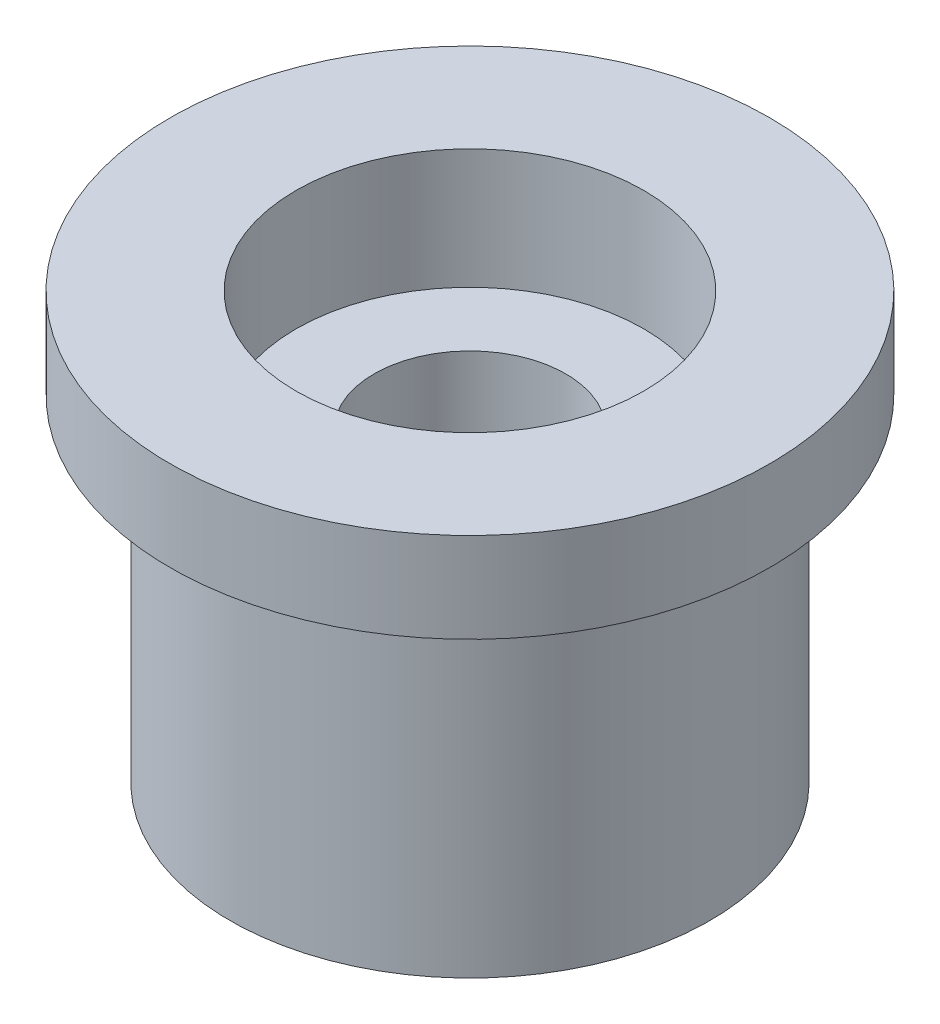
ISO-10303-21;
HEADER;
FILE_DESCRIPTION(('STEP AP214'),'2;1');
FILE_NAME('part.step','',(''),(''),'','','');
FILE_SCHEMA(('AUTOMOTIVE_DESIGN { 1 0 10303 214 1 1 1 1 }'));
ENDSEC;
DATA;
#1=APPLICATION_CONTEXT('core data for automotive mechanical design processes');
#2=APPLICATION_PROTOCOL_DEFINITION('international standard','automotive_design',2000,#1);
#3=PRODUCT_CONTEXT('',#1,'mechanical');
#4=PRODUCT('Part','Part','',(#3));
#5=PRODUCT_RELATED_PRODUCT_CATEGORY('part','',(#4));
#6=PRODUCT_DEFINITION_FORMATION('','',#4);
#7=PRODUCT_DEFINITION_CONTEXT('part definition',#1,'design');
#8=PRODUCT_DEFINITION('design','',#6,#7);
#9=PRODUCT_DEFINITION_SHAPE('','',#8);
#10=(LENGTH_UNIT() NAMED_UNIT(*) SI_UNIT(.MILLI.,.METRE.));
#11=(NAMED_UNIT(*) PLANE_ANGLE_UNIT() SI_UNIT($,.RADIAN.));
#12=(NAMED_UNIT(*) SI_UNIT($,.STERADIAN.) SOLID_ANGLE_UNIT());
#13=UNCERTAINTY_MEASURE_WITH_UNIT(LENGTH_MEASURE(1.E-05),#10,'distance_accuracy_value','');
#14=(GEOMETRIC_REPRESENTATION_CONTEXT(3) GLOBAL_UNCERTAINTY_ASSIGNED_CONTEXT((#13)) GLOBAL_UNIT_ASSIGNED_CONTEXT((#10,
#11,#12)) REPRESENTATION_CONTEXT('',''));
#15=CARTESIAN_POINT('',(0.,0.,0.));
#16=DIRECTION('',(0.,0.,1.));
#17=DIRECTION('',(1.,0.,0.));
#18=AXIS2_PLACEMENT_3D('',#15,#16,#17);
#19=CARTESIAN_POINT('',(0.,7.1,0.));
#20=DIRECTION('',(0.,-1.,0.));
#21=DIRECTION('',(0.,0.,-1.));
#22=AXIS2_PLACEMENT_3D('',#19,#20,#21);
#23=CYLINDRICAL_SURFACE('',#22,5.);
#24=CARTESIAN_POINT('',(0.,7.1,0.));
#25=DIRECTION('',(0.,-1.,0.));
#26=DIRECTION('',(0.,0.,-1.));
#27=AXIS2_PLACEMENT_3D('',#24,#25,#26);
#28=CIRCLE('',#27,5.);
#29=CARTESIAN_POINT('',(0.,7.1,-5.));
#30=VERTEX_POINT('',#29);
#31=EDGE_CURVE('E40',#30,#30,#28,.T.);
#32=ORIENTED_EDGE('',*,*,#31,.T.);
#33=EDGE_LOOP('',(#32));
#34=FACE_BOUND('',#33,.T.);
#35=CARTESIAN_POINT('',(0.,5.6,0.));
#36=DIRECTION('',(0.,-1.,0.));
#37=DIRECTION('',(0.,0.,-1.));
#38=AXIS2_PLACEMENT_3D('',#35,#36,#37);
#39=CIRCLE('',#38,5.);
#40=CARTESIAN_POINT('',(0.,5.6,-5.));
#41=VERTEX_POINT('',#40);
#42=EDGE_CURVE('E231',#41,#41,#39,.T.);
#43=ORIENTED_EDGE('',*,*,#42,.F.);
#44=EDGE_LOOP('',(#43));
#45=FACE_BOUND('',#44,.T.);
#46=ADVANCED_FACE('F37',(#34,#45),#23,.T.);
#47=CARTESIAN_POINT('',(5.,7.1,0.));
#48=DIRECTION('',(0.,1.,0.));
#49=DIRECTION('',(0.,0.,1.));
#50=AXIS2_PLACEMENT_3D('',#47,#48,#49);
#51=PLANE('',#50);
#52=CARTESIAN_POINT('',(0.,7.1,0.));
#53=DIRECTION('',(0.,1.,0.));
#54=DIRECTION('',(0.,0.,1.));
#55=AXIS2_PLACEMENT_3D('',#52,#53,#54);
#56=CIRCLE('',#55,2.9);
#57=CARTESIAN_POINT('',(0.,7.1,2.9));
#58=VERTEX_POINT('',#57);
#59=EDGE_CURVE('E331',#58,#58,#56,.T.);
#60=ORIENTED_EDGE('',*,*,#59,.F.);
#61=EDGE_LOOP('',(#60));
#62=FACE_BOUND('',#61,.T.);
#63=ORIENTED_EDGE('',*,*,#31,.F.);
#64=EDGE_LOOP('',(#63));
#65=FACE_BOUND('',#64,.T.);
#66=ADVANCED_FACE('F240',(#62,#65),#51,.T.);
#67=CARTESIAN_POINT('',(0.,5.6,0.));
#68=DIRECTION('',(0.,-1.,0.));
#69=DIRECTION('',(0.,0.,-1.));
#70=AXIS2_PLACEMENT_3D('',#67,#68,#69);
#71=PLANE('',#70);
#72=CARTESIAN_POINT('',(0.,5.6,0.));
#73=DIRECTION('',(0.,-1.,0.));
#74=DIRECTION('',(0.,0.,-1.));
#75=AXIS2_PLACEMENT_3D('',#72,#73,#74);
#76=CIRCLE('',#75,4.);
#77=CARTESIAN_POINT('',(0.,5.6,-4.));
#78=VERTEX_POINT('',#77);
#79=EDGE_CURVE('E11',#78,#78,#76,.T.);
#80=ORIENTED_EDGE('',*,*,#79,.F.);
#81=EDGE_LOOP('',(#80));
#82=FACE_BOUND('',#81,.T.);
#83=ORIENTED_EDGE('',*,*,#42,.T.);
#84=EDGE_LOOP('',(#83));
#85=FACE_BOUND('',#84,.T.);
#86=ADVANCED_FACE('F242',(#82,#85),#71,.T.);
#87=CARTESIAN_POINT('',(0.,0.,0.));
#88=DIRECTION('',(0.,1.,0.));
#89=DIRECTION('',(0.,0.,1.));
#90=AXIS2_PLACEMENT_3D('',#87,#88,#89);
#91=CYLINDRICAL_SURFACE('',#90,4.);
#92=CARTESIAN_POINT('',(0.,0.,0.));
#93=DIRECTION('',(0.,-1.,0.));
#94=DIRECTION('',(0.,0.,-1.));
#95=AXIS2_PLACEMENT_3D('',#92,#93,#94);
#96=CIRCLE('',#95,4.);
#97=CARTESIAN_POINT('',(0.,0.,-4.));
#98=VERTEX_POINT('',#97);
#99=EDGE_CURVE('E223',#98,#98,#96,.T.);
#100=ORIENTED_EDGE('',*,*,#99,.F.);
#101=EDGE_LOOP('',(#100));
#102=FACE_BOUND('',#101,.T.);
#103=ORIENTED_EDGE('',*,*,#79,.T.);
#104=EDGE_LOOP('',(#103));
#105=FACE_BOUND('',#104,.T.);
#106=ADVANCED_FACE('F248',(#102,#105),#91,.T.);
#107=CARTESIAN_POINT('',(0.,0.,0.));
#108=DIRECTION('',(0.,-1.,0.));
#109=DIRECTION('',(0.,0.,-1.));
#110=AXIS2_PLACEMENT_3D('',#107,#108,#109);
#111=PLANE('',#110);
#112=CARTESIAN_POINT('',(0.,0.,0.));
#113=DIRECTION('',(0.,1.,0.));
#114=DIRECTION('',(0.,0.,1.));
#115=AXIS2_PLACEMENT_3D('',#112,#113,#114);
#116=CIRCLE('',#115,1.60000000000001);
#117=CARTESIAN_POINT('',(0.,0.,1.60000000000001));
#118=VERTEX_POINT('',#117);
#119=EDGE_CURVE('E152',#118,#118,#116,.T.);
#120=ORIENTED_EDGE('',*,*,#119,.T.);
#121=EDGE_LOOP('',(#120));
#122=FACE_BOUND('',#121,.T.);
#123=CARTESIAN_POINT('',(0.,0.,0.));
#124=DIRECTION('',(0.,1.,0.));
#125=DIRECTION('',(0.,0.,1.));
#126=AXIS2_PLACEMENT_3D('',#123,#124,#125);
#127=CIRCLE('',#126,2.29999999999977);
#128=CARTESIAN_POINT('',(-0.786065003776485,0.,2.16150452459318));
#129=VERTEX_POINT('',#128);
#130=CARTESIAN_POINT('',(2.264950330581,0.,0.4));
#131=VERTEX_POINT('',#130);
#132=EDGE_CURVE('E52',#129,#131,#127,.T.);
#133=ORIENTED_EDGE('',*,*,#132,.F.);
#134=DIRECTION('',(0.500000000000154,0.,-0.866025403784349));
#135=VECTOR('',#134,1.);
#136=CARTESIAN_POINT('',(-1.19063245338013,0.,2.86223590239496));
#137=LINE('',#136,#135);
#138=CARTESIAN_POINT('',(-1.19063245338013,0.,2.86223590239497));
#139=VERTEX_POINT('',#138);
#140=EDGE_CURVE('E146',#139,#129,#137,.T.);
#141=ORIENTED_EDGE('',*,*,#140,.F.);
#142=CARTESIAN_POINT('',(0.,0.,0.));
#143=DIRECTION('',(0.,-1.,0.));
#144=DIRECTION('',(0.,0.,-1.));
#145=AXIS2_PLACEMENT_3D('',#142,#143,#144);
#146=CIRCLE('',#145,3.10000000000012);
#147=CARTESIAN_POINT('',(3.074085229788,0.,0.4));
#148=VERTEX_POINT('',#147);
#149=EDGE_CURVE('E149',#148,#139,#146,.T.);
#150=ORIENTED_EDGE('',*,*,#149,.F.);
#151=DIRECTION('',(1.,0.,0.));
#152=VECTOR('',#151,1.);
#153=CARTESIAN_POINT('',(2.264950330581,0.,0.4));
#154=LINE('',#153,#152);
#155=EDGE_CURVE('E158',#131,#148,#154,.T.);
#156=ORIENTED_EDGE('',*,*,#155,.F.);
#157=EDGE_LOOP('',(#133,#141,#150,#156));
#158=FACE_BOUND('',#157,.T.);
#159=CARTESIAN_POINT('',(-1.0842021724855E-13,0.,0.));
#160=DIRECTION('',(0.,-1.,0.));
#161=DIRECTION('',(0.,0.,-1.));
#162=AXIS2_PLACEMENT_3D('',#159,#160,#161);
#163=CIRCLE('',#162,3.10000000000023);
#164=CARTESIAN_POINT('',(-1.19063245338049,0.,-2.86223590239497));
#165=VERTEX_POINT('',#164);
#166=CARTESIAN_POINT('',(3.074085229788,0.,-0.4));
#167=VERTEX_POINT('',#166);
#168=EDGE_CURVE('E60',#165,#167,#163,.T.);
#169=ORIENTED_EDGE('',*,*,#168,.F.);
#170=DIRECTION('',(-0.499999999999961,0.,-0.866025403784461));
#171=VECTOR('',#170,1.);
#172=CARTESIAN_POINT('',(-0.786065003777031,0.,-2.16150452459314));
#173=LINE('',#172,#171);
#174=CARTESIAN_POINT('',(-0.78606500377703,0.,-2.16150452459314));
#175=VERTEX_POINT('',#174);
#176=EDGE_CURVE('E171',#175,#165,#173,.T.);
#177=ORIENTED_EDGE('',*,*,#176,.F.);
#178=CARTESIAN_POINT('',(-1.0842021724855E-13,0.,0.));
#179=DIRECTION('',(0.,1.,0.));
#180=DIRECTION('',(0.,0.,1.));
#181=AXIS2_PLACEMENT_3D('',#178,#179,#180);
#182=CIRCLE('',#181,2.29999999999989);
#183=CARTESIAN_POINT('',(2.264950330581,0.,-0.4));
#184=VERTEX_POINT('',#183);
#185=EDGE_CURVE('E185',#184,#175,#182,.T.);
#186=ORIENTED_EDGE('',*,*,#185,.F.);
#187=DIRECTION('',(-1.,0.,0.));
#188=VECTOR('',#187,1.);
#189=CARTESIAN_POINT('',(3.074085229788,0.,-0.4));
#190=LINE('',#189,#188);
#191=EDGE_CURVE('E182',#167,#184,#190,.T.);
#192=ORIENTED_EDGE('',*,*,#191,.F.);
#193=EDGE_LOOP('',(#169,#177,#186,#192));
#194=FACE_BOUND('',#193,.T.);
#195=CARTESIAN_POINT('',(0.,0.,0.));
#196=DIRECTION('',(0.,1.,0.));
#197=DIRECTION('',(0.,0.,1.));
#198=AXIS2_PLACEMENT_3D('',#195,#196,#197);
#199=CIRCLE('',#198,2.29999999999955);
#200=CARTESIAN_POINT('',(-1.47888532680428,0.,-1.76150452459284));
#201=VERTEX_POINT('',#200);
#202=CARTESIAN_POINT('',(-1.478885326804,0.,1.761504524593));
#203=VERTEX_POINT('',#202);
#204=EDGE_CURVE('E192',#201,#203,#199,.T.);
#205=ORIENTED_EDGE('',*,*,#204,.F.);
#206=DIRECTION('',(0.499999980511174,0.,0.866025415036317));
#207=VECTOR('',#206,1.);
#208=CARTESIAN_POINT('',(-1.88345276182339,0.,-2.4622359135509));
#209=LINE('',#208,#207);
#210=CARTESIAN_POINT('',(-1.88345276182338,0.,-2.46223591355089));
#211=VERTEX_POINT('',#210);
#212=EDGE_CURVE('E202',#211,#201,#209,.T.);
#213=ORIENTED_EDGE('',*,*,#212,.F.);
#214=CARTESIAN_POINT('',(0.,0.,0.));
#215=DIRECTION('',(0.,-1.,0.));
#216=DIRECTION('',(0.,0.,-1.));
#217=AXIS2_PLACEMENT_3D('',#214,#215,#216);
#218=CIRCLE('',#217,3.09999999999998);
#219=CARTESIAN_POINT('',(-1.88345277640753,0.,2.46223590239492));
#220=VERTEX_POINT('',#219);
#221=EDGE_CURVE('E216',#220,#211,#218,.T.);
#222=ORIENTED_EDGE('',*,*,#221,.F.);
#223=DIRECTION('',(-0.499999999999975,0.,0.866025403784453));
#224=VECTOR('',#223,1.);
#225=CARTESIAN_POINT('',(-1.478885326804,0.,1.761504524593));
#226=LINE('',#225,#224);
#227=EDGE_CURVE('E213',#203,#220,#226,.T.);
#228=ORIENTED_EDGE('',*,*,#227,.F.);
#229=EDGE_LOOP('',(#205,#213,#222,#228));
#230=FACE_BOUND('',#229,.T.);
#231=ORIENTED_EDGE('',*,*,#99,.T.);
#232=EDGE_LOOP('',(#231));
#233=FACE_BOUND('',#232,.T.);
#234=ADVANCED_FACE('F255',(#122,#158,#194,#230,#233),#111,.T.);
#235=CARTESIAN_POINT('',(0.,4.3,0.));
#236=DIRECTION('',(0.,-1.,0.));
#237=DIRECTION('',(0.,0.,-1.));
#238=AXIS2_PLACEMENT_3D('',#235,#236,#237);
#239=CYLINDRICAL_SURFACE('',#238,2.29999999999955);
#240=ORIENTED_EDGE('',*,*,#204,.T.);
#241=DIRECTION('',(0.,-1.,0.));
#242=VECTOR('',#241,1.);
#243=CARTESIAN_POINT('',(-1.478885326804,4.3,1.761504524593));
#244=LINE('',#243,#242);
#245=CARTESIAN_POINT('',(-1.478885326804,4.3,1.761504524593));
#246=VERTEX_POINT('',#245);
#247=EDGE_CURVE('E211',#246,#203,#244,.T.);
#248=ORIENTED_EDGE('',*,*,#247,.F.);
#249=CARTESIAN_POINT('',(0.,4.3,0.));
#250=DIRECTION('',(0.,1.,0.));
#251=DIRECTION('',(0.,0.,1.));
#252=AXIS2_PLACEMENT_3D('',#249,#250,#251);
#253=CIRCLE('',#252,2.29999999999955);
#254=CARTESIAN_POINT('',(-1.47888532680428,4.3,-1.76150452459284));
#255=VERTEX_POINT('',#254);
#256=EDGE_CURVE('E198',#255,#246,#253,.T.);
#257=ORIENTED_EDGE('',*,*,#256,.F.);
#258=DIRECTION('',(0.,-1.,0.));
#259=VECTOR('',#258,1.);
#260=CARTESIAN_POINT('',(-1.47888532680428,4.3,-1.76150452459284));
#261=LINE('',#260,#259);
#262=EDGE_CURVE('E221',#255,#201,#261,.T.);
#263=ORIENTED_EDGE('',*,*,#262,.T.);
#264=EDGE_LOOP('',(#240,#248,#257,#263));
#265=FACE_BOUND('',#264,.T.);
#266=ADVANCED_FACE('F259',(#265),#239,.T.);
#267=CARTESIAN_POINT('',(-1.88345276182339,4.3,-2.4622359135509));
#268=DIRECTION('',(0.866025415036317,0.,-0.499999980511174));
#269=DIRECTION('',(-0.499999980511174,0.,-0.866025415036317));
#270=AXIS2_PLACEMENT_3D('',#267,#268,#269);
#271=PLANE('',#270);
#272=ORIENTED_EDGE('',*,*,#212,.T.);
#273=ORIENTED_EDGE('',*,*,#262,.F.);
#274=DIRECTION('',(0.499999980511174,0.,0.866025415036317));
#275=VECTOR('',#274,1.);
#276=CARTESIAN_POINT('',(-1.88345276182339,4.3,-2.4622359135509));
#277=LINE('',#276,#275);
#278=CARTESIAN_POINT('',(-1.88345276182338,4.3,-2.46223591355089));
#279=VERTEX_POINT('',#278);
#280=EDGE_CURVE('E208',#279,#255,#277,.T.);
#281=ORIENTED_EDGE('',*,*,#280,.F.);
#282=DIRECTION('',(0.,-1.,0.));
#283=VECTOR('',#282,1.);
#284=CARTESIAN_POINT('',(-1.88345276182338,4.3,-2.46223591355089));
#285=LINE('',#284,#283);
#286=EDGE_CURVE('E224',#279,#211,#285,.T.);
#287=ORIENTED_EDGE('',*,*,#286,.T.);
#288=EDGE_LOOP('',(#272,#273,#281,#287));
#289=FACE_BOUND('',#288,.T.);
#290=ADVANCED_FACE('F263',(#289),#271,.F.);
#291=CARTESIAN_POINT('',(0.,4.3,0.));
#292=DIRECTION('',(0.,-1.,0.));
#293=DIRECTION('',(0.,0.,-1.));
#294=AXIS2_PLACEMENT_3D('',#291,#292,#293);
#295=CYLINDRICAL_SURFACE('',#294,3.09999999999998);
#296=ORIENTED_EDGE('',*,*,#221,.T.);
#297=ORIENTED_EDGE('',*,*,#286,.F.);
#298=CARTESIAN_POINT('',(0.,4.3,0.));
#299=DIRECTION('',(0.,-1.,0.));
#300=DIRECTION('',(0.,0.,-1.));
#301=AXIS2_PLACEMENT_3D('',#298,#299,#300);
#302=CIRCLE('',#301,3.09999999999998);
#303=CARTESIAN_POINT('',(-1.88345277640753,4.3,2.46223590239492));
#304=VERTEX_POINT('',#303);
#305=EDGE_CURVE('E205',#304,#279,#302,.T.);
#306=ORIENTED_EDGE('',*,*,#305,.F.);
#307=DIRECTION('',(0.,-1.,0.));
#308=VECTOR('',#307,1.);
#309=CARTESIAN_POINT('',(-1.88345277640753,4.3,2.46223590239492));
#310=LINE('',#309,#308);
#311=EDGE_CURVE('E226',#304,#220,#310,.T.);
#312=ORIENTED_EDGE('',*,*,#311,.T.);
#313=EDGE_LOOP('',(#296,#297,#306,#312));
#314=FACE_BOUND('',#313,.T.);
#315=ADVANCED_FACE('F269',(#314),#295,.F.);
#316=CARTESIAN_POINT('',(-1.478885326804,4.3,1.761504524593));
#317=DIRECTION('',(0.866025403784453,0.,0.499999999999975));
#318=DIRECTION('',(0.499999999999975,0.,-0.866025403784453));
#319=AXIS2_PLACEMENT_3D('',#316,#317,#318);
#320=PLANE('',#319);
#321=ORIENTED_EDGE('',*,*,#227,.T.);
#322=ORIENTED_EDGE('',*,*,#311,.F.);
#323=DIRECTION('',(-0.499999999999975,0.,0.866025403784453));
#324=VECTOR('',#323,1.);
#325=CARTESIAN_POINT('',(-1.478885326804,4.3,1.761504524593));
#326=LINE('',#325,#324);
#327=EDGE_CURVE('E201',#246,#304,#326,.T.);
#328=ORIENTED_EDGE('',*,*,#327,.F.);
#329=ORIENTED_EDGE('',*,*,#247,.T.);
#330=EDGE_LOOP('',(#321,#322,#328,#329));
#331=FACE_BOUND('',#330,.T.);
#332=ADVANCED_FACE('F265',(#331),#320,.F.);
#333=CARTESIAN_POINT('',(0.,4.3,0.));
#334=DIRECTION('',(0.,1.,0.));
#335=DIRECTION('',(0.,0.,1.));
#336=AXIS2_PLACEMENT_3D('',#333,#334,#335);
#337=PLANE('',#336);
#338=ORIENTED_EDGE('',*,*,#256,.T.);
#339=ORIENTED_EDGE('',*,*,#327,.T.);
#340=ORIENTED_EDGE('',*,*,#305,.T.);
#341=ORIENTED_EDGE('',*,*,#280,.T.);
#342=EDGE_LOOP('',(#338,#339,#340,#341));
#343=FACE_BOUND('',#342,.T.);
#344=ADVANCED_FACE('F268',(#343),#337,.F.);
#345=CARTESIAN_POINT('',(-1.0842021724855E-13,4.3,0.));
#346=DIRECTION('',(0.,-1.,0.));
#347=DIRECTION('',(0.,0.,-1.));
#348=AXIS2_PLACEMENT_3D('',#345,#346,#347);
#349=CYLINDRICAL_SURFACE('',#348,3.10000000000023);
#350=ORIENTED_EDGE('',*,*,#168,.T.);
#351=DIRECTION('',(0.,-1.,0.));
#352=VECTOR('',#351,1.);
#353=CARTESIAN_POINT('',(3.074085229788,4.3,-0.4));
#354=LINE('',#353,#352);
#355=CARTESIAN_POINT('',(3.074085229788,4.3,-0.4));
#356=VERTEX_POINT('',#355);
#357=EDGE_CURVE('E180',#356,#167,#354,.T.);
#358=ORIENTED_EDGE('',*,*,#357,.F.);
#359=CARTESIAN_POINT('',(-1.0842021724855E-13,4.3,0.));
#360=DIRECTION('',(0.,-1.,0.));
#361=DIRECTION('',(0.,0.,-1.));
#362=AXIS2_PLACEMENT_3D('',#359,#360,#361);
#363=CIRCLE('',#362,3.10000000000023);
#364=CARTESIAN_POINT('',(-1.19063245338049,4.3,-2.86223590239497));
#365=VERTEX_POINT('',#364);
#366=EDGE_CURVE('E167',#365,#356,#363,.T.);
#367=ORIENTED_EDGE('',*,*,#366,.F.);
#368=DIRECTION('',(0.,-1.,0.));
#369=VECTOR('',#368,1.);
#370=CARTESIAN_POINT('',(-1.19063245338049,4.3,-2.86223590239497));
#371=LINE('',#370,#369);
#372=EDGE_CURVE('E190',#365,#165,#371,.T.);
#373=ORIENTED_EDGE('',*,*,#372,.T.);
#374=EDGE_LOOP('',(#350,#358,#367,#373));
#375=FACE_BOUND('',#374,.T.);
#376=ADVANCED_FACE('F279',(#375),#349,.F.);
#377=CARTESIAN_POINT('',(-0.786065003777031,4.3,-2.16150452459314));
#378=DIRECTION('',(-0.866025403784461,0.,0.499999999999961));
#379=DIRECTION('',(0.499999999999961,0.,0.866025403784461));
#380=AXIS2_PLACEMENT_3D('',#377,#378,#379);
#381=PLANE('',#380);
#382=ORIENTED_EDGE('',*,*,#176,.T.);
#383=ORIENTED_EDGE('',*,*,#372,.F.);
#384=DIRECTION('',(-0.499999999999961,0.,-0.866025403784461));
#385=VECTOR('',#384,1.);
#386=CARTESIAN_POINT('',(-0.786065003777031,4.3,-2.16150452459314));
#387=LINE('',#386,#385);
#388=CARTESIAN_POINT('',(-0.78606500377703,4.3,-2.16150452459314));
#389=VERTEX_POINT('',#388);
#390=EDGE_CURVE('E177',#389,#365,#387,.T.);
#391=ORIENTED_EDGE('',*,*,#390,.F.);
#392=DIRECTION('',(0.,-1.,0.));
#393=VECTOR('',#392,1.);
#394=CARTESIAN_POINT('',(-0.78606500377703,4.3,-2.16150452459314));
#395=LINE('',#394,#393);
#396=EDGE_CURVE('E193',#389,#175,#395,.T.);
#397=ORIENTED_EDGE('',*,*,#396,.T.);
#398=EDGE_LOOP('',(#382,#383,#391,#397));
#399=FACE_BOUND('',#398,.T.);
#400=ADVANCED_FACE('F283',(#399),#381,.F.);
#401=CARTESIAN_POINT('',(-1.0842021724855E-13,4.3,0.));
#402=DIRECTION('',(0.,-1.,0.));
#403=DIRECTION('',(0.,0.,-1.));
#404=AXIS2_PLACEMENT_3D('',#401,#402,#403);
#405=CYLINDRICAL_SURFACE('',#404,2.29999999999989);
#406=ORIENTED_EDGE('',*,*,#185,.T.);
#407=ORIENTED_EDGE('',*,*,#396,.F.);
#408=CARTESIAN_POINT('',(-1.0842021724855E-13,4.3,0.));
#409=DIRECTION('',(0.,1.,0.));
#410=DIRECTION('',(0.,0.,1.));
#411=AXIS2_PLACEMENT_3D('',#408,#409,#410);
#412=CIRCLE('',#411,2.29999999999989);
#413=CARTESIAN_POINT('',(2.264950330581,4.3,-0.4));
#414=VERTEX_POINT('',#413);
#415=EDGE_CURVE('E174',#414,#389,#412,.T.);
#416=ORIENTED_EDGE('',*,*,#415,.F.);
#417=DIRECTION('',(0.,-1.,0.));
#418=VECTOR('',#417,1.);
#419=CARTESIAN_POINT('',(2.264950330581,4.3,-0.4));
#420=LINE('',#419,#418);
#421=EDGE_CURVE('E195',#414,#184,#420,.T.);
#422=ORIENTED_EDGE('',*,*,#421,.T.);
#423=EDGE_LOOP('',(#406,#407,#416,#422));
#424=FACE_BOUND('',#423,.T.);
#425=ADVANCED_FACE('F288',(#424),#405,.T.);
#426=CARTESIAN_POINT('',(3.074085229788,4.3,-0.4));
#427=DIRECTION('',(0.,0.,1.));
#428=DIRECTION('',(1.,0.,0.));
#429=AXIS2_PLACEMENT_3D('',#426,#427,#428);
#430=PLANE('',#429);
#431=ORIENTED_EDGE('',*,*,#191,.T.);
#432=ORIENTED_EDGE('',*,*,#421,.F.);
#433=DIRECTION('',(-1.,0.,0.));
#434=VECTOR('',#433,1.);
#435=CARTESIAN_POINT('',(3.074085229788,4.3,-0.4));
#436=LINE('',#435,#434);
#437=EDGE_CURVE('E170',#356,#414,#436,.T.);
#438=ORIENTED_EDGE('',*,*,#437,.F.);
#439=ORIENTED_EDGE('',*,*,#357,.T.);
#440=EDGE_LOOP('',(#431,#432,#438,#439));
#441=FACE_BOUND('',#440,.T.);
#442=ADVANCED_FACE('F284',(#441),#430,.F.);
#443=CARTESIAN_POINT('',(-1.0842021724855E-13,4.3,0.));
#444=DIRECTION('',(0.,-1.,0.));
#445=DIRECTION('',(0.,0.,-1.));
#446=AXIS2_PLACEMENT_3D('',#443,#444,#445);
#447=PLANE('',#446);
#448=ORIENTED_EDGE('',*,*,#366,.T.);
#449=ORIENTED_EDGE('',*,*,#437,.T.);
#450=ORIENTED_EDGE('',*,*,#415,.T.);
#451=ORIENTED_EDGE('',*,*,#390,.T.);
#452=EDGE_LOOP('',(#448,#449,#450,#451));
#453=FACE_BOUND('',#452,.T.);
#454=ADVANCED_FACE('F287',(#453),#447,.T.);
#455=CARTESIAN_POINT('',(0.,4.3,0.));
#456=DIRECTION('',(0.,-1.,0.));
#457=DIRECTION('',(0.,0.,-1.));
#458=AXIS2_PLACEMENT_3D('',#455,#456,#457);
#459=CYLINDRICAL_SURFACE('',#458,2.29999999999977);
#460=ORIENTED_EDGE('',*,*,#132,.T.);
#461=DIRECTION('',(0.,-1.,0.));
#462=VECTOR('',#461,1.);
#463=CARTESIAN_POINT('',(2.264950330581,4.3,0.4));
#464=LINE('',#463,#462);
#465=CARTESIAN_POINT('',(2.264950330581,4.3,0.4));
#466=VERTEX_POINT('',#465);
#467=EDGE_CURVE('E124',#466,#131,#464,.T.);
#468=ORIENTED_EDGE('',*,*,#467,.F.);
#469=CARTESIAN_POINT('',(0.,4.3,0.));
#470=DIRECTION('',(0.,1.,0.));
#471=DIRECTION('',(0.,0.,1.));
#472=AXIS2_PLACEMENT_3D('',#469,#470,#471);
#473=CIRCLE('',#472,2.29999999999977);
#474=CARTESIAN_POINT('',(-0.786065003776485,4.3,2.16150452459318));
#475=VERTEX_POINT('',#474);
#476=EDGE_CURVE('E128',#475,#466,#473,.T.);
#477=ORIENTED_EDGE('',*,*,#476,.F.);
#478=DIRECTION('',(0.,-1.,0.));
#479=VECTOR('',#478,1.);
#480=CARTESIAN_POINT('',(-0.786065003776485,4.3,2.16150452459318));
#481=LINE('',#480,#479);
#482=EDGE_CURVE('E162',#475,#129,#481,.T.);
#483=ORIENTED_EDGE('',*,*,#482,.T.);
#484=EDGE_LOOP('',(#460,#468,#477,#483));
#485=FACE_BOUND('',#484,.T.);
#486=ADVANCED_FACE('F126',(#485),#459,.T.);
#487=CARTESIAN_POINT('',(-1.19063245338013,4.3,2.86223590239496));
#488=DIRECTION('',(-0.86602540378435,0.,-0.500000000000154));
#489=DIRECTION('',(-0.500000000000154,0.,0.86602540378435));
#490=AXIS2_PLACEMENT_3D('',#487,#488,#489);
#491=PLANE('',#490);
#492=ORIENTED_EDGE('',*,*,#140,.T.);
#493=ORIENTED_EDGE('',*,*,#482,.F.);
#494=DIRECTION('',(0.500000000000154,0.,-0.866025403784349));
#495=VECTOR('',#494,1.);
#496=CARTESIAN_POINT('',(-1.19063245338013,4.3,2.86223590239496));
#497=LINE('',#496,#495);
#498=CARTESIAN_POINT('',(-1.19063245338013,4.3,2.86223590239497));
#499=VERTEX_POINT('',#498);
#500=EDGE_CURVE('E134',#499,#475,#497,.T.);
#501=ORIENTED_EDGE('',*,*,#500,.F.);
#502=DIRECTION('',(0.,-1.,0.));
#503=VECTOR('',#502,1.);
#504=CARTESIAN_POINT('',(-1.19063245338013,4.3,2.86223590239497));
#505=LINE('',#504,#503);
#506=EDGE_CURVE('E164',#499,#139,#505,.T.);
#507=ORIENTED_EDGE('',*,*,#506,.T.);
#508=EDGE_LOOP('',(#492,#493,#501,#507));
#509=FACE_BOUND('',#508,.T.);
#510=ADVANCED_FACE('F301',(#509),#491,.F.);
#511=CARTESIAN_POINT('',(0.,4.3,0.));
#512=DIRECTION('',(0.,-1.,0.));
#513=DIRECTION('',(0.,0.,-1.));
#514=AXIS2_PLACEMENT_3D('',#511,#512,#513);
#515=CYLINDRICAL_SURFACE('',#514,3.10000000000012);
#516=ORIENTED_EDGE('',*,*,#149,.T.);
#517=ORIENTED_EDGE('',*,*,#506,.F.);
#518=CARTESIAN_POINT('',(0.,4.3,0.));
#519=DIRECTION('',(0.,-1.,0.));
#520=DIRECTION('',(0.,0.,-1.));
#521=AXIS2_PLACEMENT_3D('',#518,#519,#520);
#522=CIRCLE('',#521,3.10000000000012);
#523=CARTESIAN_POINT('',(3.074085229788,4.3,0.4));
#524=VERTEX_POINT('',#523);
#525=EDGE_CURVE('E142',#524,#499,#522,.T.);
#526=ORIENTED_EDGE('',*,*,#525,.F.);
#527=DIRECTION('',(0.,-1.,0.));
#528=VECTOR('',#527,1.);
#529=CARTESIAN_POINT('',(3.074085229788,4.3,0.4));
#530=LINE('',#529,#528);
#531=EDGE_CURVE('E133',#524,#148,#530,.T.);
#532=ORIENTED_EDGE('',*,*,#531,.T.);
#533=EDGE_LOOP('',(#516,#517,#526,#532));
#534=FACE_BOUND('',#533,.T.);
#535=ADVANCED_FACE('F304',(#534),#515,.F.);
#536=CARTESIAN_POINT('',(2.264950330581,4.3,0.4));
#537=DIRECTION('',(0.,0.,-1.));
#538=DIRECTION('',(-1.,0.,0.));
#539=AXIS2_PLACEMENT_3D('',#536,#537,#538);
#540=PLANE('',#539);
#541=ORIENTED_EDGE('',*,*,#155,.T.);
#542=ORIENTED_EDGE('',*,*,#531,.F.);
#543=DIRECTION('',(1.,0.,0.));
#544=VECTOR('',#543,1.);
#545=CARTESIAN_POINT('',(2.264950330581,4.3,0.4));
#546=LINE('',#545,#544);
#547=EDGE_CURVE('E137',#466,#524,#546,.T.);
#548=ORIENTED_EDGE('',*,*,#547,.F.);
#549=ORIENTED_EDGE('',*,*,#467,.T.);
#550=EDGE_LOOP('',(#541,#542,#548,#549));
#551=FACE_BOUND('',#550,.T.);
#552=ADVANCED_FACE('F138',(#551),#540,.F.);
#553=CARTESIAN_POINT('',(0.,4.3,0.));
#554=DIRECTION('',(0.,1.,0.));
#555=DIRECTION('',(0.,0.,1.));
#556=AXIS2_PLACEMENT_3D('',#553,#554,#555);
#557=PLANE('',#556);
#558=ORIENTED_EDGE('',*,*,#476,.T.);
#559=ORIENTED_EDGE('',*,*,#547,.T.);
#560=ORIENTED_EDGE('',*,*,#525,.T.);
#561=ORIENTED_EDGE('',*,*,#500,.T.);
#562=EDGE_LOOP('',(#558,#559,#560,#561));
#563=FACE_BOUND('',#562,.T.);
#564=ADVANCED_FACE('F144',(#563),#557,.F.);
#565=CARTESIAN_POINT('',(0.,7.1,0.));
#566=DIRECTION('',(0.,1.,0.));
#567=DIRECTION('',(0.,0.,1.));
#568=AXIS2_PLACEMENT_3D('',#565,#566,#567);
#569=CYLINDRICAL_SURFACE('',#568,1.60000000000001);
#570=ORIENTED_EDGE('',*,*,#119,.F.);
#571=EDGE_LOOP('',(#570));
#572=FACE_BOUND('',#571,.T.);
#573=CARTESIAN_POINT('',(0.,5.1,0.));
#574=DIRECTION('',(0.,1.,0.));
#575=DIRECTION('',(0.,0.,1.));
#576=AXIS2_PLACEMENT_3D('',#573,#574,#575);
#577=CIRCLE('',#576,1.60000000000001);
#578=CARTESIAN_POINT('',(0.,5.1,1.60000000000001));
#579=VERTEX_POINT('',#578);
#580=EDGE_CURVE('E333',#579,#579,#577,.T.);
#581=ORIENTED_EDGE('',*,*,#580,.T.);
#582=EDGE_LOOP('',(#581));
#583=FACE_BOUND('',#582,.T.);
#584=ADVANCED_FACE('F313',(#572,#583),#569,.F.);
#585=CARTESIAN_POINT('',(1.60000000000001,5.1,0.));
#586=DIRECTION('',(0.,-1.,0.));
#587=DIRECTION('',(0.,0.,-1.));
#588=AXIS2_PLACEMENT_3D('',#585,#586,#587);
#589=PLANE('',#588);
#590=ORIENTED_EDGE('',*,*,#580,.F.);
#591=EDGE_LOOP('',(#590));
#592=FACE_BOUND('',#591,.T.);
#593=CARTESIAN_POINT('',(0.,5.1,0.));
#594=DIRECTION('',(0.,1.,0.));
#595=DIRECTION('',(0.,0.,1.));
#596=AXIS2_PLACEMENT_3D('',#593,#594,#595);
#597=CIRCLE('',#596,2.9);
#598=CARTESIAN_POINT('',(0.,5.1,2.9));
#599=VERTEX_POINT('',#598);
#600=EDGE_CURVE('E329',#599,#599,#597,.T.);
#601=ORIENTED_EDGE('',*,*,#600,.T.);
#602=EDGE_LOOP('',(#601));
#603=FACE_BOUND('',#602,.T.);
#604=ADVANCED_FACE('F316',(#592,#603),#589,.F.);
#605=CARTESIAN_POINT('',(0.,7.1,0.));
#606=DIRECTION('',(0.,1.,0.));
#607=DIRECTION('',(0.,0.,1.));
#608=AXIS2_PLACEMENT_3D('',#605,#606,#607);
#609=CYLINDRICAL_SURFACE('',#608,2.9);
#610=ORIENTED_EDGE('',*,*,#600,.F.);
#611=EDGE_LOOP('',(#610));
#612=FACE_BOUND('',#611,.T.);
#613=ORIENTED_EDGE('',*,*,#59,.T.);
#614=EDGE_LOOP('',(#613));
#615=FACE_BOUND('',#614,.T.);
#616=ADVANCED_FACE('F320',(#612,#615),#609,.F.);
#617=CLOSED_SHELL('',(#46,#66,#86,#106,#234,#266,#290,#315,#332,#344,#376,#400,#425,#442,#454,
#486,#510,#535,#552,#564,#584,#604,#616));
#618=MANIFOLD_SOLID_BREP('B2',#617);
#619=ADVANCED_BREP_SHAPE_REPRESENTATION('',(#18,#618),#14);
#620=SHAPE_DEFINITION_REPRESENTATION(#9,#619);
ENDSEC;
END-ISO-10303-21;
